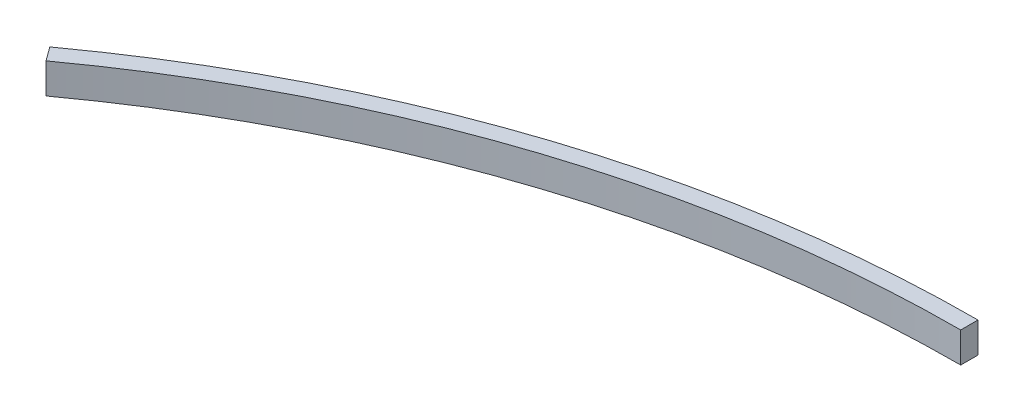
ISO-10303-21;
HEADER;
FILE_DESCRIPTION(('STEP AP214'),'2;1');
FILE_NAME('part.step','',(''),(''),'','','');
FILE_SCHEMA(('AUTOMOTIVE_DESIGN { 1 0 10303 214 1 1 1 1 }'));
ENDSEC;
DATA;
#1=APPLICATION_CONTEXT('core data for automotive mechanical design processes');
#2=APPLICATION_PROTOCOL_DEFINITION('international standard','automotive_design',2000,#1);
#3=PRODUCT_CONTEXT('',#1,'mechanical');
#4=PRODUCT('Part','Part','',(#3));
#5=PRODUCT_RELATED_PRODUCT_CATEGORY('part','',(#4));
#6=PRODUCT_DEFINITION_FORMATION('','',#4);
#7=PRODUCT_DEFINITION_CONTEXT('part definition',#1,'design');
#8=PRODUCT_DEFINITION('design','',#6,#7);
#9=PRODUCT_DEFINITION_SHAPE('','',#8);
#10=(LENGTH_UNIT() NAMED_UNIT(*) SI_UNIT(.MILLI.,.METRE.));
#11=(NAMED_UNIT(*) PLANE_ANGLE_UNIT() SI_UNIT($,.RADIAN.));
#12=(NAMED_UNIT(*) SI_UNIT($,.STERADIAN.) SOLID_ANGLE_UNIT());
#13=UNCERTAINTY_MEASURE_WITH_UNIT(LENGTH_MEASURE(1.E-05),#10,'distance_accuracy_value','');
#14=(GEOMETRIC_REPRESENTATION_CONTEXT(3) GLOBAL_UNCERTAINTY_ASSIGNED_CONTEXT((#13)) GLOBAL_UNIT_ASSIGNED_CONTEXT((#10,
#11,#12)) REPRESENTATION_CONTEXT('',''));
#15=CARTESIAN_POINT('',(0.,0.,0.));
#16=DIRECTION('',(0.,0.,1.));
#17=DIRECTION('',(1.,0.,0.));
#18=AXIS2_PLACEMENT_3D('',#15,#16,#17);
#19=CARTESIAN_POINT('',(0.,2.794,0.));
#20=DIRECTION('',(0.,-1.,0.));
#21=DIRECTION('',(0.,0.,-1.));
#22=AXIS2_PLACEMENT_3D('',#19,#20,#21);
#23=CYLINDRICAL_SURFACE('',#22,107.95);
#24=CARTESIAN_POINT('',(0.,0.,0.));
#25=DIRECTION('',(0.,-1.,0.));
#26=DIRECTION('',(0.,0.,1.));
#27=AXIS2_PLACEMENT_3D('',#24,#25,#26);
#28=CIRCLE('',#27,107.95);
#29=CARTESIAN_POINT('',(-63.4514179849727,0.,-87.3333845427754));
#30=VERTEX_POINT('',#29);
#31=CARTESIAN_POINT('',(0.,0.,-107.95));
#32=VERTEX_POINT('',#31);
#33=EDGE_CURVE('E96',#30,#32,#28,.T.);
#34=ORIENTED_EDGE('',*,*,#33,.T.);
#35=DIRECTION('',(0.,-1.,0.));
#36=VECTOR('',#35,1.);
#37=CARTESIAN_POINT('',(0.,2.794,-107.95));
#38=LINE('',#37,#36);
#39=CARTESIAN_POINT('',(0.,2.794,-107.95));
#40=VERTEX_POINT('',#39);
#41=EDGE_CURVE('E11',#40,#32,#38,.T.);
#42=ORIENTED_EDGE('',*,*,#41,.F.);
#43=CARTESIAN_POINT('',(0.,2.794,0.));
#44=DIRECTION('',(0.,-1.,0.));
#45=DIRECTION('',(0.,0.,1.));
#46=AXIS2_PLACEMENT_3D('',#43,#44,#45);
#47=CIRCLE('',#46,107.95);
#48=CARTESIAN_POINT('',(-63.4514179849727,2.794,-87.3333845427754));
#49=VERTEX_POINT('',#48);
#50=EDGE_CURVE('E84',#49,#40,#47,.T.);
#51=ORIENTED_EDGE('',*,*,#50,.F.);
#52=DIRECTION('',(0.,-1.,0.));
#53=VECTOR('',#52,1.);
#54=CARTESIAN_POINT('',(-63.4514179849727,2.794,-87.3333845427754));
#55=LINE('',#54,#53);
#56=EDGE_CURVE('E92',#49,#30,#55,.T.);
#57=ORIENTED_EDGE('',*,*,#56,.T.);
#58=EDGE_LOOP('',(#34,#42,#51,#57));
#59=FACE_BOUND('',#58,.T.);
#60=ADVANCED_FACE('F33',(#59),#23,.F.);
#61=CARTESIAN_POINT('',(0.,2.794,-109.5375));
#62=DIRECTION('',(-1.,0.,0.));
#63=DIRECTION('',(0.,0.,1.));
#64=AXIS2_PLACEMENT_3D('',#61,#62,#63);
#65=PLANE('',#64);
#66=DIRECTION('',(0.,0.,-1.));
#67=VECTOR('',#66,1.);
#68=CARTESIAN_POINT('',(0.,0.,-109.5375));
#69=LINE('',#68,#67);
#70=CARTESIAN_POINT('',(0.,0.,-109.5375));
#71=VERTEX_POINT('',#70);
#72=EDGE_CURVE('E88',#32,#71,#69,.T.);
#73=ORIENTED_EDGE('',*,*,#72,.T.);
#74=DIRECTION('',(0.,-1.,0.));
#75=VECTOR('',#74,1.);
#76=CARTESIAN_POINT('',(0.,2.794,-109.5375));
#77=LINE('',#76,#75);
#78=CARTESIAN_POINT('',(0.,2.794,-109.5375));
#79=VERTEX_POINT('',#78);
#80=EDGE_CURVE('E41',#79,#71,#77,.T.);
#81=ORIENTED_EDGE('',*,*,#80,.F.);
#82=DIRECTION('',(0.,0.,-1.));
#83=VECTOR('',#82,1.);
#84=CARTESIAN_POINT('',(0.,2.794,-109.5375));
#85=LINE('',#84,#83);
#86=EDGE_CURVE('E79',#40,#79,#85,.T.);
#87=ORIENTED_EDGE('',*,*,#86,.F.);
#88=ORIENTED_EDGE('',*,*,#41,.T.);
#89=EDGE_LOOP('',(#73,#81,#87,#88));
#90=FACE_BOUND('',#89,.T.);
#91=ADVANCED_FACE('F87',(#90),#65,.F.);
#92=CARTESIAN_POINT('',(0.,2.794,0.));
#93=DIRECTION('',(0.,-1.,0.));
#94=DIRECTION('',(0.,0.,-1.));
#95=AXIS2_PLACEMENT_3D('',#92,#93,#94);
#96=CYLINDRICAL_SURFACE('',#95,109.5375);
#97=CARTESIAN_POINT('',(0.,0.,0.));
#98=DIRECTION('',(0.,1.,0.));
#99=DIRECTION('',(0.,0.,1.));
#100=AXIS2_PLACEMENT_3D('',#97,#98,#99);
#101=CIRCLE('',#100,109.5375);
#102=CARTESIAN_POINT('',(-64.384527072987,0.,-88.6176990213457));
#103=VERTEX_POINT('',#102);
#104=EDGE_CURVE('E66',#71,#103,#101,.T.);
#105=ORIENTED_EDGE('',*,*,#104,.T.);
#106=DIRECTION('',(0.,-1.,0.));
#107=VECTOR('',#106,1.);
#108=CARTESIAN_POINT('',(-64.384527072987,2.794,-88.6176990213457));
#109=LINE('',#108,#107);
#110=CARTESIAN_POINT('',(-64.384527072987,2.794,-88.6176990213457));
#111=VERTEX_POINT('',#110);
#112=EDGE_CURVE('E89',#111,#103,#109,.T.);
#113=ORIENTED_EDGE('',*,*,#112,.F.);
#114=CARTESIAN_POINT('',(0.,2.794,0.));
#115=DIRECTION('',(0.,1.,0.));
#116=DIRECTION('',(0.,0.,1.));
#117=AXIS2_PLACEMENT_3D('',#114,#115,#116);
#118=CIRCLE('',#117,109.5375);
#119=EDGE_CURVE('E82',#79,#111,#118,.T.);
#120=ORIENTED_EDGE('',*,*,#119,.F.);
#121=ORIENTED_EDGE('',*,*,#80,.T.);
#122=EDGE_LOOP('',(#105,#113,#120,#121));
#123=FACE_BOUND('',#122,.T.);
#124=ADVANCED_FACE('F90',(#123),#96,.T.);
#125=CARTESIAN_POINT('',(-64.384527072987,2.794,-88.6176990213457));
#126=DIRECTION('',(0.809016994374947,0.,-0.587785252292474));
#127=DIRECTION('',(-0.587785252292474,0.,-0.809016994374947));
#128=AXIS2_PLACEMENT_3D('',#125,#126,#127);
#129=PLANE('',#128);
#130=DIRECTION('',(0.587785252292474,0.,0.809016994374947));
#131=VECTOR('',#130,1.);
#132=CARTESIAN_POINT('',(-64.384527072987,0.,-88.6176990213457));
#133=LINE('',#132,#131);
#134=EDGE_CURVE('E72',#103,#30,#133,.T.);
#135=ORIENTED_EDGE('',*,*,#134,.T.);
#136=ORIENTED_EDGE('',*,*,#56,.F.);
#137=DIRECTION('',(0.587785252292474,0.,0.809016994374947));
#138=VECTOR('',#137,1.);
#139=CARTESIAN_POINT('',(-64.384527072987,2.794,-88.6176990213457));
#140=LINE('',#139,#138);
#141=EDGE_CURVE('E49',#111,#49,#140,.T.);
#142=ORIENTED_EDGE('',*,*,#141,.F.);
#143=ORIENTED_EDGE('',*,*,#112,.T.);
#144=EDGE_LOOP('',(#135,#136,#142,#143));
#145=FACE_BOUND('',#144,.T.);
#146=ADVANCED_FACE('F103',(#145),#129,.F.);
#147=CARTESIAN_POINT('',(0.,2.794,0.));
#148=DIRECTION('',(0.,1.,0.));
#149=DIRECTION('',(0.,0.,1.));
#150=AXIS2_PLACEMENT_3D('',#147,#148,#149);
#151=PLANE('',#150);
#152=ORIENTED_EDGE('',*,*,#50,.T.);
#153=ORIENTED_EDGE('',*,*,#86,.T.);
#154=ORIENTED_EDGE('',*,*,#119,.T.);
#155=ORIENTED_EDGE('',*,*,#141,.T.);
#156=EDGE_LOOP('',(#152,#153,#154,#155));
#157=FACE_BOUND('',#156,.T.);
#158=ADVANCED_FACE('F80',(#157),#151,.T.);
#159=CARTESIAN_POINT('',(0.,0.,0.));
#160=DIRECTION('',(0.,1.,0.));
#161=DIRECTION('',(0.,0.,1.));
#162=AXIS2_PLACEMENT_3D('',#159,#160,#161);
#163=PLANE('',#162);
#164=ORIENTED_EDGE('',*,*,#33,.F.);
#165=ORIENTED_EDGE('',*,*,#134,.F.);
#166=ORIENTED_EDGE('',*,*,#104,.F.);
#167=ORIENTED_EDGE('',*,*,#72,.F.);
#168=EDGE_LOOP('',(#164,#165,#166,#167));
#169=FACE_BOUND('',#168,.T.);
#170=ADVANCED_FACE('F106',(#169),#163,.F.);
#171=CLOSED_SHELL('',(#60,#91,#124,#146,#158,#170));
#172=MANIFOLD_SOLID_BREP('B2',#171);
#173=ADVANCED_BREP_SHAPE_REPRESENTATION('',(#18,#172),#14);
#174=SHAPE_DEFINITION_REPRESENTATION(#9,#173);
ENDSEC;
END-ISO-10303-21;
